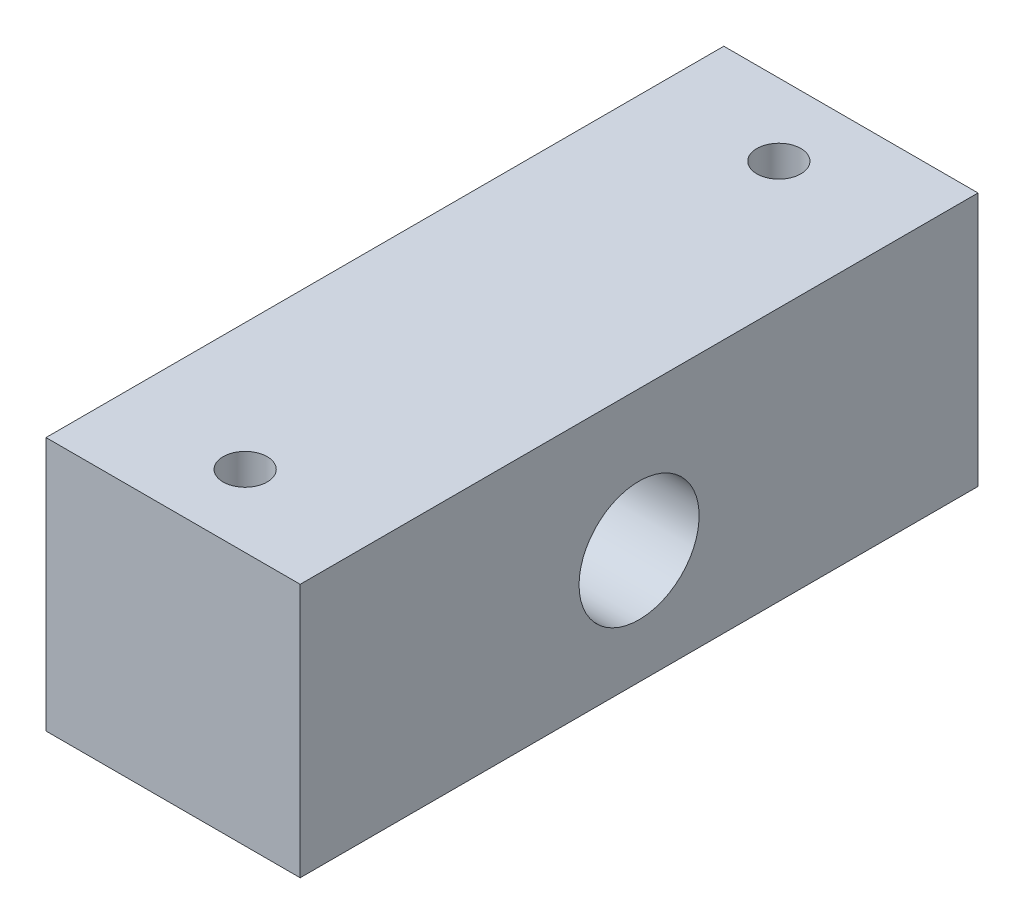
ISO-10303-21;
HEADER;
FILE_DESCRIPTION(('STEP AP214'),'2;1');
FILE_NAME('part.step','',(''),(''),'','','');
FILE_SCHEMA(('AUTOMOTIVE_DESIGN { 1 0 10303 214 1 1 1 1 }'));
ENDSEC;
DATA;
#1=APPLICATION_CONTEXT('core data for automotive mechanical design processes');
#2=APPLICATION_PROTOCOL_DEFINITION('international standard','automotive_design',2000,#1);
#3=PRODUCT_CONTEXT('',#1,'mechanical');
#4=PRODUCT('Part','Part','',(#3));
#5=PRODUCT_RELATED_PRODUCT_CATEGORY('part','',(#4));
#6=PRODUCT_DEFINITION_FORMATION('','',#4);
#7=PRODUCT_DEFINITION_CONTEXT('part definition',#1,'design');
#8=PRODUCT_DEFINITION('design','',#6,#7);
#9=PRODUCT_DEFINITION_SHAPE('','',#8);
#10=(LENGTH_UNIT() NAMED_UNIT(*) SI_UNIT(.MILLI.,.METRE.));
#11=(NAMED_UNIT(*) PLANE_ANGLE_UNIT() SI_UNIT($,.RADIAN.));
#12=(NAMED_UNIT(*) SI_UNIT($,.STERADIAN.) SOLID_ANGLE_UNIT());
#13=UNCERTAINTY_MEASURE_WITH_UNIT(LENGTH_MEASURE(1.E-05),#10,'distance_accuracy_value','');
#14=(GEOMETRIC_REPRESENTATION_CONTEXT(3) GLOBAL_UNCERTAINTY_ASSIGNED_CONTEXT((#13)) GLOBAL_UNIT_ASSIGNED_CONTEXT((#10,
#11,#12)) REPRESENTATION_CONTEXT('',''));
#15=CARTESIAN_POINT('',(0.,0.,0.));
#16=DIRECTION('',(0.,0.,1.));
#17=DIRECTION('',(1.,0.,0.));
#18=AXIS2_PLACEMENT_3D('',#15,#16,#17);
#19=CARTESIAN_POINT('',(9.525,9.525,25.4));
#20=DIRECTION('',(-1.,0.,0.));
#21=DIRECTION('',(0.,-1.,0.));
#22=AXIS2_PLACEMENT_3D('',#19,#20,#21);
#23=PLANE('',#22);
#24=CARTESIAN_POINT('',(9.52500000000001,-0.975000000000002,0.));
#25=DIRECTION('',(-1.,0.,0.));
#26=DIRECTION('',(0.,0.,1.));
#27=AXIS2_PLACEMENT_3D('',#24,#25,#26);
#28=CIRCLE('',#27,4.5);
#29=CARTESIAN_POINT('',(9.52500000000001,-0.975000000000002,4.5));
#30=VERTEX_POINT('',#29);
#31=EDGE_CURVE('E121',#30,#30,#28,.T.);
#32=ORIENTED_EDGE('',*,*,#31,.T.);
#33=EDGE_LOOP('',(#32));
#34=FACE_BOUND('',#33,.T.);
#35=DIRECTION('',(0.,1.,0.));
#36=VECTOR('',#35,1.);
#37=CARTESIAN_POINT('',(9.525,9.525,-25.4));
#38=LINE('',#37,#36);
#39=CARTESIAN_POINT('',(9.525,-9.525,-25.4));
#40=VERTEX_POINT('',#39);
#41=CARTESIAN_POINT('',(9.525,9.525,-25.4));
#42=VERTEX_POINT('',#41);
#43=EDGE_CURVE('E96',#40,#42,#38,.T.);
#44=ORIENTED_EDGE('',*,*,#43,.T.);
#45=DIRECTION('',(0.,0.,-1.));
#46=VECTOR('',#45,1.);
#47=CARTESIAN_POINT('',(9.525,9.525,25.4));
#48=LINE('',#47,#46);
#49=CARTESIAN_POINT('',(9.525,9.525,25.4));
#50=VERTEX_POINT('',#49);
#51=EDGE_CURVE('E11',#50,#42,#48,.T.);
#52=ORIENTED_EDGE('',*,*,#51,.F.);
#53=DIRECTION('',(0.,1.,0.));
#54=VECTOR('',#53,1.);
#55=CARTESIAN_POINT('',(9.525,9.525,25.4));
#56=LINE('',#55,#54);
#57=CARTESIAN_POINT('',(9.525,-9.525,25.4));
#58=VERTEX_POINT('',#57);
#59=EDGE_CURVE('E84',#58,#50,#56,.T.);
#60=ORIENTED_EDGE('',*,*,#59,.F.);
#61=DIRECTION('',(0.,0.,-1.));
#62=VECTOR('',#61,1.);
#63=CARTESIAN_POINT('',(9.525,-9.525,25.4));
#64=LINE('',#63,#62);
#65=EDGE_CURVE('E92',#58,#40,#64,.T.);
#66=ORIENTED_EDGE('',*,*,#65,.T.);
#67=EDGE_LOOP('',(#44,#52,#60,#66));
#68=FACE_BOUND('',#67,.T.);
#69=ADVANCED_FACE('F33',(#34,#68),#23,.F.);
#70=CARTESIAN_POINT('',(-9.525,9.525,25.4));
#71=DIRECTION('',(0.,-1.,0.));
#72=DIRECTION('',(0.,0.,-1.));
#73=AXIS2_PLACEMENT_3D('',#70,#71,#72);
#74=PLANE('',#73);
#75=CARTESIAN_POINT('',(0.,9.525,-20.));
#76=DIRECTION('',(0.,1.,0.));
#77=DIRECTION('',(0.,0.,1.));
#78=AXIS2_PLACEMENT_3D('',#75,#76,#77);
#79=CIRCLE('',#78,1.65);
#80=CARTESIAN_POINT('',(0.,9.525,-18.35));
#81=VERTEX_POINT('',#80);
#82=EDGE_CURVE('E118',#81,#81,#79,.T.);
#83=ORIENTED_EDGE('',*,*,#82,.F.);
#84=EDGE_LOOP('',(#83));
#85=FACE_BOUND('',#84,.T.);
#86=CARTESIAN_POINT('',(0.,9.525,20.));
#87=DIRECTION('',(0.,1.,0.));
#88=DIRECTION('',(0.,0.,1.));
#89=AXIS2_PLACEMENT_3D('',#86,#87,#88);
#90=CIRCLE('',#89,1.65);
#91=CARTESIAN_POINT('',(0.,9.525,21.65));
#92=VERTEX_POINT('',#91);
#93=EDGE_CURVE('E112',#92,#92,#90,.T.);
#94=ORIENTED_EDGE('',*,*,#93,.F.);
#95=EDGE_LOOP('',(#94));
#96=FACE_BOUND('',#95,.T.);
#97=DIRECTION('',(-1.,0.,0.));
#98=VECTOR('',#97,1.);
#99=CARTESIAN_POINT('',(-9.525,9.525,-25.4));
#100=LINE('',#99,#98);
#101=CARTESIAN_POINT('',(-9.525,9.525,-25.4));
#102=VERTEX_POINT('',#101);
#103=EDGE_CURVE('E88',#42,#102,#100,.T.);
#104=ORIENTED_EDGE('',*,*,#103,.T.);
#105=DIRECTION('',(0.,0.,-1.));
#106=VECTOR('',#105,1.);
#107=CARTESIAN_POINT('',(-9.525,9.525,25.4));
#108=LINE('',#107,#106);
#109=CARTESIAN_POINT('',(-9.525,9.525,25.4));
#110=VERTEX_POINT('',#109);
#111=EDGE_CURVE('E41',#110,#102,#108,.T.);
#112=ORIENTED_EDGE('',*,*,#111,.F.);
#113=DIRECTION('',(-1.,0.,0.));
#114=VECTOR('',#113,1.);
#115=CARTESIAN_POINT('',(-9.525,9.525,25.4));
#116=LINE('',#115,#114);
#117=EDGE_CURVE('E79',#50,#110,#116,.T.);
#118=ORIENTED_EDGE('',*,*,#117,.F.);
#119=ORIENTED_EDGE('',*,*,#51,.T.);
#120=EDGE_LOOP('',(#104,#112,#118,#119));
#121=FACE_BOUND('',#120,.T.);
#122=ADVANCED_FACE('F87',(#85,#96,#121),#74,.F.);
#123=CARTESIAN_POINT('',(-9.525,9.525,25.4));
#124=DIRECTION('',(1.,0.,0.));
#125=DIRECTION('',(0.,1.,0.));
#126=AXIS2_PLACEMENT_3D('',#123,#124,#125);
#127=PLANE('',#126);
#128=CARTESIAN_POINT('',(-9.525,-0.975000000000002,0.));
#129=DIRECTION('',(-1.,0.,0.));
#130=DIRECTION('',(0.,0.,1.));
#131=AXIS2_PLACEMENT_3D('',#128,#129,#130);
#132=CIRCLE('',#131,4.5);
#133=CARTESIAN_POINT('',(-9.525,-0.975000000000002,4.5));
#134=VERTEX_POINT('',#133);
#135=EDGE_CURVE('E124',#134,#134,#132,.T.);
#136=ORIENTED_EDGE('',*,*,#135,.F.);
#137=EDGE_LOOP('',(#136));
#138=FACE_BOUND('',#137,.T.);
#139=DIRECTION('',(0.,-1.,0.));
#140=VECTOR('',#139,1.);
#141=CARTESIAN_POINT('',(-9.525,9.525,-25.4));
#142=LINE('',#141,#140);
#143=CARTESIAN_POINT('',(-9.525,-9.525,-25.4));
#144=VERTEX_POINT('',#143);
#145=EDGE_CURVE('E66',#102,#144,#142,.T.);
#146=ORIENTED_EDGE('',*,*,#145,.T.);
#147=DIRECTION('',(0.,0.,-1.));
#148=VECTOR('',#147,1.);
#149=CARTESIAN_POINT('',(-9.525,-9.525,25.4));
#150=LINE('',#149,#148);
#151=CARTESIAN_POINT('',(-9.525,-9.525,25.4));
#152=VERTEX_POINT('',#151);
#153=EDGE_CURVE('E89',#152,#144,#150,.T.);
#154=ORIENTED_EDGE('',*,*,#153,.F.);
#155=DIRECTION('',(0.,-1.,0.));
#156=VECTOR('',#155,1.);
#157=CARTESIAN_POINT('',(-9.525,9.525,25.4));
#158=LINE('',#157,#156);
#159=EDGE_CURVE('E82',#110,#152,#158,.T.);
#160=ORIENTED_EDGE('',*,*,#159,.F.);
#161=ORIENTED_EDGE('',*,*,#111,.T.);
#162=EDGE_LOOP('',(#146,#154,#160,#161));
#163=FACE_BOUND('',#162,.T.);
#164=ADVANCED_FACE('F90',(#138,#163),#127,.F.);
#165=CARTESIAN_POINT('',(-9.525,-9.525,25.4));
#166=DIRECTION('',(0.,1.,0.));
#167=DIRECTION('',(0.,0.,1.));
#168=AXIS2_PLACEMENT_3D('',#165,#166,#167);
#169=PLANE('',#168);
#170=CARTESIAN_POINT('',(0.,-9.525,-20.));
#171=DIRECTION('',(0.,1.,0.));
#172=DIRECTION('',(0.,0.,1.));
#173=AXIS2_PLACEMENT_3D('',#170,#171,#172);
#174=CIRCLE('',#173,1.65);
#175=CARTESIAN_POINT('',(0.,-9.525,-18.35));
#176=VERTEX_POINT('',#175);
#177=EDGE_CURVE('E115',#176,#176,#174,.T.);
#178=ORIENTED_EDGE('',*,*,#177,.T.);
#179=EDGE_LOOP('',(#178));
#180=FACE_BOUND('',#179,.T.);
#181=CARTESIAN_POINT('',(0.,-9.525,20.));
#182=DIRECTION('',(0.,1.,0.));
#183=DIRECTION('',(0.,0.,1.));
#184=AXIS2_PLACEMENT_3D('',#181,#182,#183);
#185=CIRCLE('',#184,1.65);
#186=CARTESIAN_POINT('',(0.,-9.525,21.65));
#187=VERTEX_POINT('',#186);
#188=EDGE_CURVE('E99',#187,#187,#185,.T.);
#189=ORIENTED_EDGE('',*,*,#188,.T.);
#190=EDGE_LOOP('',(#189));
#191=FACE_BOUND('',#190,.T.);
#192=DIRECTION('',(1.,0.,0.));
#193=VECTOR('',#192,1.);
#194=CARTESIAN_POINT('',(-9.525,-9.525,-25.4));
#195=LINE('',#194,#193);
#196=EDGE_CURVE('E72',#144,#40,#195,.T.);
#197=ORIENTED_EDGE('',*,*,#196,.T.);
#198=ORIENTED_EDGE('',*,*,#65,.F.);
#199=DIRECTION('',(1.,0.,0.));
#200=VECTOR('',#199,1.);
#201=CARTESIAN_POINT('',(-9.525,-9.525,25.4));
#202=LINE('',#201,#200);
#203=EDGE_CURVE('E49',#152,#58,#202,.T.);
#204=ORIENTED_EDGE('',*,*,#203,.F.);
#205=ORIENTED_EDGE('',*,*,#153,.T.);
#206=EDGE_LOOP('',(#197,#198,#204,#205));
#207=FACE_BOUND('',#206,.T.);
#208=ADVANCED_FACE('F104',(#180,#191,#207),#169,.F.);
#209=CARTESIAN_POINT('',(0.,0.,25.4));
#210=DIRECTION('',(0.,0.,1.));
#211=DIRECTION('',(1.,0.,0.));
#212=AXIS2_PLACEMENT_3D('',#209,#210,#211);
#213=PLANE('',#212);
#214=ORIENTED_EDGE('',*,*,#59,.T.);
#215=ORIENTED_EDGE('',*,*,#117,.T.);
#216=ORIENTED_EDGE('',*,*,#159,.T.);
#217=ORIENTED_EDGE('',*,*,#203,.T.);
#218=EDGE_LOOP('',(#214,#215,#216,#217));
#219=FACE_BOUND('',#218,.T.);
#220=ADVANCED_FACE('F80',(#219),#213,.T.);
#221=CARTESIAN_POINT('',(0.,0.,-25.4));
#222=DIRECTION('',(0.,0.,1.));
#223=DIRECTION('',(1.,0.,0.));
#224=AXIS2_PLACEMENT_3D('',#221,#222,#223);
#225=PLANE('',#224);
#226=ORIENTED_EDGE('',*,*,#43,.F.);
#227=ORIENTED_EDGE('',*,*,#196,.F.);
#228=ORIENTED_EDGE('',*,*,#145,.F.);
#229=ORIENTED_EDGE('',*,*,#103,.F.);
#230=EDGE_LOOP('',(#226,#227,#228,#229));
#231=FACE_BOUND('',#230,.T.);
#232=ADVANCED_FACE('F107',(#231),#225,.F.);
#233=CARTESIAN_POINT('',(0.,9.525,20.));
#234=DIRECTION('',(0.,1.,0.));
#235=DIRECTION('',(0.,0.,1.));
#236=AXIS2_PLACEMENT_3D('',#233,#234,#235);
#237=CYLINDRICAL_SURFACE('',#236,1.65);
#238=ORIENTED_EDGE('',*,*,#188,.F.);
#239=EDGE_LOOP('',(#238));
#240=FACE_BOUND('',#239,.T.);
#241=ORIENTED_EDGE('',*,*,#93,.T.);
#242=EDGE_LOOP('',(#241));
#243=FACE_BOUND('',#242,.T.);
#244=ADVANCED_FACE('F152',(#240,#243),#237,.F.);
#245=CARTESIAN_POINT('',(0.,9.525,-20.));
#246=DIRECTION('',(0.,1.,0.));
#247=DIRECTION('',(0.,0.,1.));
#248=AXIS2_PLACEMENT_3D('',#245,#246,#247);
#249=CYLINDRICAL_SURFACE('',#248,1.65);
#250=ORIENTED_EDGE('',*,*,#177,.F.);
#251=EDGE_LOOP('',(#250));
#252=FACE_BOUND('',#251,.T.);
#253=ORIENTED_EDGE('',*,*,#82,.T.);
#254=EDGE_LOOP('',(#253));
#255=FACE_BOUND('',#254,.T.);
#256=ADVANCED_FACE('F148',(#252,#255),#249,.F.);
#257=CARTESIAN_POINT('',(-9.525,-0.975000000000002,0.));
#258=DIRECTION('',(-1.,0.,0.));
#259=DIRECTION('',(0.,0.,1.));
#260=AXIS2_PLACEMENT_3D('',#257,#258,#259);
#261=CYLINDRICAL_SURFACE('',#260,4.5);
#262=ORIENTED_EDGE('',*,*,#31,.F.);
#263=EDGE_LOOP('',(#262));
#264=FACE_BOUND('',#263,.T.);
#265=ORIENTED_EDGE('',*,*,#135,.T.);
#266=EDGE_LOOP('',(#265));
#267=FACE_BOUND('',#266,.T.);
#268=ADVANCED_FACE('F128',(#264,#267),#261,.F.);
#269=CLOSED_SHELL('',(#69,#122,#164,#208,#220,#232,#244,#256,#268));
#270=MANIFOLD_SOLID_BREP('B2',#269);
#271=ADVANCED_BREP_SHAPE_REPRESENTATION('',(#18,#270),#14);
#272=SHAPE_DEFINITION_REPRESENTATION(#9,#271);
ENDSEC;
END-ISO-10303-21;
